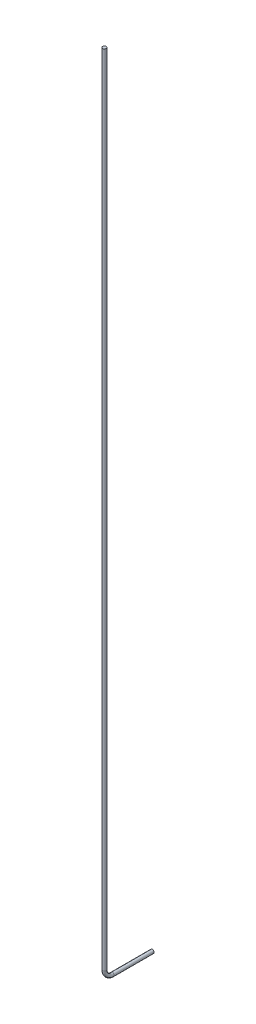
ISO-10303-21;
HEADER;
FILE_DESCRIPTION(('STEP AP214'),'2;1');
FILE_NAME('part.step','',(''),(''),'','','');
FILE_SCHEMA(('AUTOMOTIVE_DESIGN { 1 0 10303 214 1 1 1 1 }'));
ENDSEC;
DATA;
#1=APPLICATION_CONTEXT('core data for automotive mechanical design processes');
#2=APPLICATION_PROTOCOL_DEFINITION('international standard','automotive_design',2000,#1);
#3=PRODUCT_CONTEXT('',#1,'mechanical');
#4=PRODUCT('Part','Part','',(#3));
#5=PRODUCT_RELATED_PRODUCT_CATEGORY('part','',(#4));
#6=PRODUCT_DEFINITION_FORMATION('','',#4);
#7=PRODUCT_DEFINITION_CONTEXT('part definition',#1,'design');
#8=PRODUCT_DEFINITION('design','',#6,#7);
#9=PRODUCT_DEFINITION_SHAPE('','',#8);
#10=(LENGTH_UNIT() NAMED_UNIT(*) SI_UNIT(.MILLI.,.METRE.));
#11=(NAMED_UNIT(*) PLANE_ANGLE_UNIT() SI_UNIT($,.RADIAN.));
#12=(NAMED_UNIT(*) SI_UNIT($,.STERADIAN.) SOLID_ANGLE_UNIT());
#13=UNCERTAINTY_MEASURE_WITH_UNIT(LENGTH_MEASURE(1.E-05),#10,'distance_accuracy_value','');
#14=(GEOMETRIC_REPRESENTATION_CONTEXT(3) GLOBAL_UNCERTAINTY_ASSIGNED_CONTEXT((#13)) GLOBAL_UNIT_ASSIGNED_CONTEXT((#10,
#11,#12)) REPRESENTATION_CONTEXT('',''));
#15=CARTESIAN_POINT('',(0.,0.,0.));
#16=DIRECTION('',(0.,0.,1.));
#17=DIRECTION('',(1.,0.,0.));
#18=AXIS2_PLACEMENT_3D('',#15,#16,#17);
#19=CARTESIAN_POINT('',(0.,0.,20.));
#20=DIRECTION('',(0.,0.,-1.));
#21=DIRECTION('',(-1.,0.,0.));
#22=AXIS2_PLACEMENT_3D('',#19,#20,#21);
#23=CYLINDRICAL_SURFACE('',#22,1.13);
#24=CARTESIAN_POINT('',(0.,0.,0.));
#25=DIRECTION('',(0.,0.,1.));
#26=DIRECTION('',(1.,0.,0.));
#27=AXIS2_PLACEMENT_3D('',#24,#25,#26);
#28=CIRCLE('',#27,1.13);
#29=CARTESIAN_POINT('',(1.13,0.,0.));
#30=VERTEX_POINT('',#29);
#31=EDGE_CURVE('E10',#30,#30,#28,.T.);
#32=ORIENTED_EDGE('',*,*,#31,.T.);
#33=EDGE_LOOP('',(#32));
#34=FACE_BOUND('',#33,.T.);
#35=CARTESIAN_POINT('',(0.,0.,25.));
#36=DIRECTION('',(0.,0.,1.));
#37=DIRECTION('',(1.,0.,0.));
#38=AXIS2_PLACEMENT_3D('',#35,#36,#37);
#39=CIRCLE('',#38,1.13);
#40=CARTESIAN_POINT('',(0.,-1.12999999999984,25.));
#41=VERTEX_POINT('',#40);
#42=EDGE_CURVE('E51',#41,#41,#39,.T.);
#43=ORIENTED_EDGE('',*,*,#42,.F.);
#44=EDGE_LOOP('',(#43));
#45=FACE_BOUND('',#44,.T.);
#46=ADVANCED_FACE('F37',(#34,#45),#23,.T.);
#47=CARTESIAN_POINT('',(0.,0.,0.));
#48=DIRECTION('',(0.,0.,1.));
#49=DIRECTION('',(1.,0.,0.));
#50=AXIS2_PLACEMENT_3D('',#47,#48,#49);
#51=PLANE('',#50);
#52=ORIENTED_EDGE('',*,*,#31,.F.);
#53=EDGE_LOOP('',(#52));
#54=FACE_BOUND('',#53,.T.);
#55=ADVANCED_FACE('F60',(#54),#51,.F.);
#56=CARTESIAN_POINT('',(0.,505.,30.));
#57=DIRECTION('',(0.,1.,0.));
#58=DIRECTION('',(1.,0.,0.));
#59=AXIS2_PLACEMENT_3D('',#56,#57,#58);
#60=PLANE('',#59);
#61=CARTESIAN_POINT('',(0.,505.,30.));
#62=DIRECTION('',(0.,1.,0.));
#63=DIRECTION('',(1.,0.,0.));
#64=AXIS2_PLACEMENT_3D('',#61,#62,#63);
#65=CIRCLE('',#64,1.13);
#66=CARTESIAN_POINT('',(1.13,505.,30.));
#67=VERTEX_POINT('',#66);
#68=EDGE_CURVE('E43',#67,#67,#65,.T.);
#69=ORIENTED_EDGE('',*,*,#68,.T.);
#70=EDGE_LOOP('',(#69));
#71=FACE_BOUND('',#70,.T.);
#72=ADVANCED_FACE('F64',(#71),#60,.T.);
#73=CARTESIAN_POINT('',(0.,5.,25.));
#74=DIRECTION('',(-1.,0.,0.));
#75=DIRECTION('',(0.,0.,1.));
#76=AXIS2_PLACEMENT_3D('',#73,#74,#75);
#77=TOROIDAL_SURFACE('',#76,4.99999999999984,1.13);
#78=CARTESIAN_POINT('',(0.,5.,30.));
#79=DIRECTION('',(0.,1.,0.));
#80=DIRECTION('',(1.,0.,0.));
#81=AXIS2_PLACEMENT_3D('',#78,#79,#80);
#82=CIRCLE('',#81,1.13);
#83=CARTESIAN_POINT('',(0.,5.,31.1299999999998));
#84=VERTEX_POINT('',#83);
#85=EDGE_CURVE('E47',#84,#84,#82,.T.);
#86=CARTESIAN_POINT('',(0.,5.,25.));
#87=DIRECTION('',(-1.,0.,0.));
#88=DIRECTION('',(0.,0.,1.));
#89=AXIS2_PLACEMENT_3D('',#86,#87,#88);
#90=CIRCLE('',#89,6.12999999999984);
#91=EDGE_CURVE('',#41,#84,#90,.T.);
#92=ORIENTED_EDGE('',*,*,#42,.T.);
#93=ORIENTED_EDGE('',*,*,#85,.F.);
#94=ORIENTED_EDGE('',*,*,#91,.T.);
#95=ORIENTED_EDGE('',*,*,#91,.F.);
#96=EDGE_LOOP('',(#92,#94,#93,#95));
#97=FACE_BOUND('',#96,.T.);
#98=ADVANCED_FACE('F57',(#97),#77,.T.);
#99=CARTESIAN_POINT('',(0.,5.,30.));
#100=DIRECTION('',(0.,1.,0.));
#101=DIRECTION('',(0.,0.,1.));
#102=AXIS2_PLACEMENT_3D('',#99,#100,#101);
#103=CYLINDRICAL_SURFACE('',#102,1.13);
#104=ORIENTED_EDGE('',*,*,#68,.F.);
#105=EDGE_LOOP('',(#104));
#106=FACE_BOUND('',#105,.T.);
#107=ORIENTED_EDGE('',*,*,#85,.T.);
#108=EDGE_LOOP('',(#107));
#109=FACE_BOUND('',#108,.T.);
#110=ADVANCED_FACE('F66',(#106,#109),#103,.T.);
#111=CLOSED_SHELL('',(#46,#55,#72,#98,#110));
#112=MANIFOLD_SOLID_BREP('B2',#111);
#113=ADVANCED_BREP_SHAPE_REPRESENTATION('',(#18,#112),#14);
#114=SHAPE_DEFINITION_REPRESENTATION(#9,#113);
ENDSEC;
END-ISO-10303-21;
